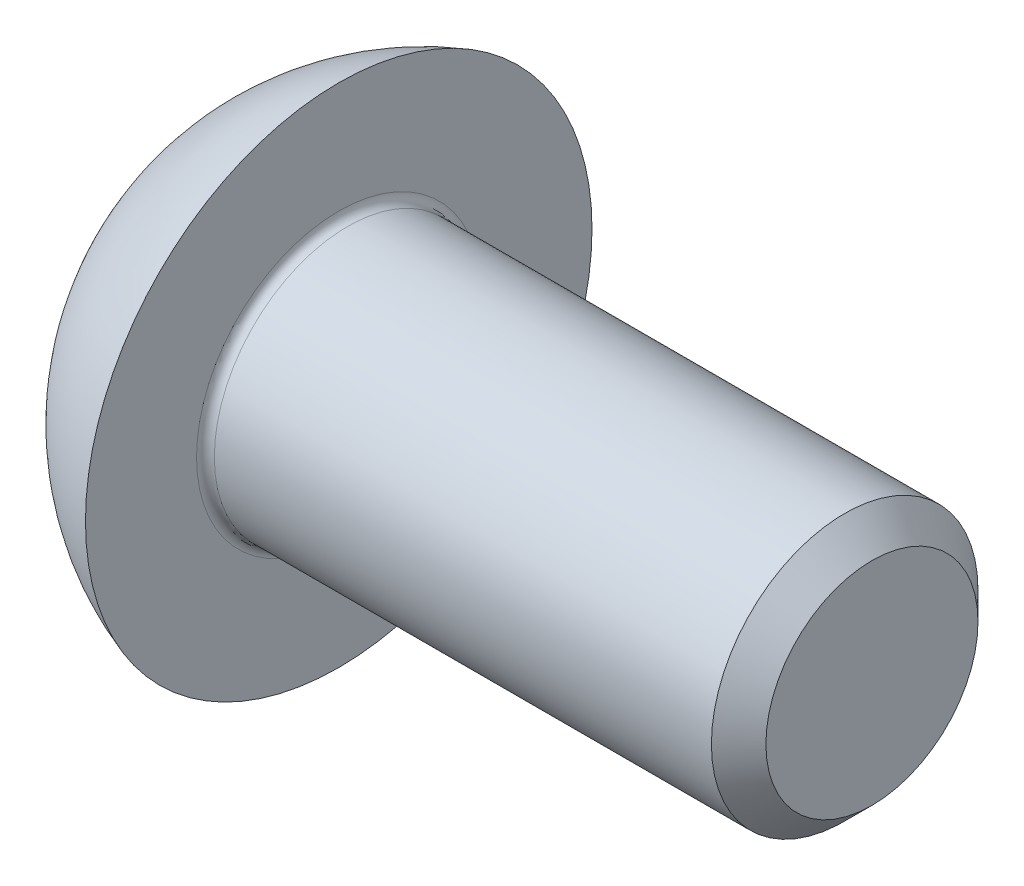
ISO-10303-21;
HEADER;
FILE_DESCRIPTION(('STEP AP214'),'2;1');
FILE_NAME('part.step','',(''),(''),'','','');
FILE_SCHEMA(('AUTOMOTIVE_DESIGN { 1 0 10303 214 1 1 1 1 }'));
ENDSEC;
DATA;
#1=APPLICATION_CONTEXT('core data for automotive mechanical design processes');
#2=APPLICATION_PROTOCOL_DEFINITION('international standard','automotive_design',2000,#1);
#3=PRODUCT_CONTEXT('',#1,'mechanical');
#4=PRODUCT('Part','Part','',(#3));
#5=PRODUCT_RELATED_PRODUCT_CATEGORY('part','',(#4));
#6=PRODUCT_DEFINITION_FORMATION('','',#4);
#7=PRODUCT_DEFINITION_CONTEXT('part definition',#1,'design');
#8=PRODUCT_DEFINITION('design','',#6,#7);
#9=PRODUCT_DEFINITION_SHAPE('','',#8);
#10=(LENGTH_UNIT() NAMED_UNIT(*) SI_UNIT(.MILLI.,.METRE.));
#11=(NAMED_UNIT(*) PLANE_ANGLE_UNIT() SI_UNIT($,.RADIAN.));
#12=(NAMED_UNIT(*) SI_UNIT($,.STERADIAN.) SOLID_ANGLE_UNIT());
#13=UNCERTAINTY_MEASURE_WITH_UNIT(LENGTH_MEASURE(1.E-05),#10,'distance_accuracy_value','');
#14=(GEOMETRIC_REPRESENTATION_CONTEXT(3) GLOBAL_UNCERTAINTY_ASSIGNED_CONTEXT((#13)) GLOBAL_UNIT_ASSIGNED_CONTEXT((#10,
#11,#12)) REPRESENTATION_CONTEXT('',''));
#15=CARTESIAN_POINT('',(0.,0.,0.));
#16=DIRECTION('',(0.,0.,1.));
#17=DIRECTION('',(1.,0.,0.));
#18=AXIS2_PLACEMENT_3D('',#15,#16,#17);
#19=CARTESIAN_POINT('',(6.,-1.1945,1.1945));
#20=DIRECTION('',(1.,0.,0.));
#21=DIRECTION('',(0.,0.,-1.));
#22=AXIS2_PLACEMENT_3D('',#19,#20,#21);
#23=PLANE('',#22);
#24=CARTESIAN_POINT('',(6.,0.,0.));
#25=DIRECTION('',(-1.,0.,0.));
#26=DIRECTION('',(0.,0.,1.));
#27=AXIS2_PLACEMENT_3D('',#24,#25,#26);
#28=CIRCLE('',#27,1.1935);
#29=CARTESIAN_POINT('',(6.,0.,1.1935));
#30=VERTEX_POINT('',#29);
#31=EDGE_CURVE('E22',#30,#30,#28,.T.);
#32=ORIENTED_EDGE('',*,*,#31,.F.);
#33=EDGE_LOOP('',(#32));
#34=FACE_BOUND('',#33,.T.);
#35=ADVANCED_FACE('F17',(#34),#23,.T.);
#36=CARTESIAN_POINT('',(5.6935,0.,0.));
#37=DIRECTION('',(-1.,0.,0.));
#38=DIRECTION('',(0.,0.,1.));
#39=AXIS2_PLACEMENT_3D('',#36,#37,#38);
#40=CONICAL_SURFACE('',#39,1.5,0.785398163397447);
#41=ORIENTED_EDGE('',*,*,#31,.T.);
#42=EDGE_LOOP('',(#41));
#43=FACE_BOUND('',#42,.T.);
#44=CARTESIAN_POINT('',(5.6935,0.,0.));
#45=DIRECTION('',(-1.,0.,0.));
#46=DIRECTION('',(0.,0.,1.));
#47=AXIS2_PLACEMENT_3D('',#44,#45,#46);
#48=CIRCLE('',#47,1.5);
#49=CARTESIAN_POINT('',(5.6935,0.,1.5));
#50=VERTEX_POINT('',#49);
#51=EDGE_CURVE('E151',#50,#50,#48,.T.);
#52=ORIENTED_EDGE('',*,*,#51,.F.);
#53=EDGE_LOOP('',(#52));
#54=FACE_BOUND('',#53,.T.);
#55=ADVANCED_FACE('F233',(#43,#54),#40,.T.);
#56=CARTESIAN_POINT('',(5.6935,0.,0.));
#57=DIRECTION('',(-1.,0.,0.));
#58=DIRECTION('',(0.,0.,1.));
#59=AXIS2_PLACEMENT_3D('',#56,#57,#58);
#60=CYLINDRICAL_SURFACE('',#59,1.5);
#61=CARTESIAN_POINT('',(0.0999999999999998,0.,0.));
#62=DIRECTION('',(-1.,0.,0.));
#63=DIRECTION('',(0.,0.,1.));
#64=AXIS2_PLACEMENT_3D('',#61,#62,#63);
#65=CIRCLE('',#64,1.5);
#66=CARTESIAN_POINT('',(0.0999999999999998,0.,1.5));
#67=VERTEX_POINT('',#66);
#68=EDGE_CURVE('E147',#67,#67,#65,.T.);
#69=ORIENTED_EDGE('',*,*,#68,.F.);
#70=EDGE_LOOP('',(#69));
#71=FACE_BOUND('',#70,.T.);
#72=ORIENTED_EDGE('',*,*,#51,.T.);
#73=EDGE_LOOP('',(#72));
#74=FACE_BOUND('',#73,.T.);
#75=ADVANCED_FACE('F227',(#71,#74),#60,.T.);
#76=CARTESIAN_POINT('',(0.0999999999999996,0.,0.));
#77=DIRECTION('',(1.,0.,0.));
#78=DIRECTION('',(0.,0.,-1.));
#79=AXIS2_PLACEMENT_3D('',#76,#77,#78);
#80=TOROIDAL_SURFACE('',#79,1.6,0.0999999999999997);
#81=CARTESIAN_POINT('',(0.,0.,0.));
#82=DIRECTION('',(1.,0.,0.));
#83=DIRECTION('',(0.,0.,-1.));
#84=AXIS2_PLACEMENT_3D('',#81,#82,#83);
#85=CIRCLE('',#84,1.6);
#86=CARTESIAN_POINT('',(0.,0.,-1.6));
#87=VERTEX_POINT('',#86);
#88=EDGE_CURVE('E150',#87,#87,#85,.F.);
#89=ORIENTED_EDGE('',*,*,#88,.F.);
#90=EDGE_LOOP('',(#89));
#91=FACE_BOUND('',#90,.T.);
#92=ORIENTED_EDGE('',*,*,#68,.T.);
#93=EDGE_LOOP('',(#92));
#94=FACE_BOUND('',#93,.T.);
#95=ADVANCED_FACE('F224',(#91,#94),#80,.F.);
#96=CARTESIAN_POINT('',(0.,-2.90802,2.851));
#97=DIRECTION('',(1.,0.,0.));
#98=DIRECTION('',(0.,0.,-1.));
#99=AXIS2_PLACEMENT_3D('',#96,#97,#98);
#100=PLANE('',#99);
#101=ORIENTED_EDGE('',*,*,#88,.T.);
#102=EDGE_LOOP('',(#101));
#103=FACE_BOUND('',#102,.T.);
#104=CARTESIAN_POINT('',(0.,0.,0.));
#105=DIRECTION('',(-1.,0.,0.));
#106=DIRECTION('',(0.,0.,1.));
#107=AXIS2_PLACEMENT_3D('',#104,#105,#106);
#108=CIRCLE('',#107,2.85);
#109=CARTESIAN_POINT('',(0.,2.84999999999999,0.));
#110=VERTEX_POINT('',#109);
#111=EDGE_CURVE('E212',#110,#110,#108,.T.);
#112=ORIENTED_EDGE('',*,*,#111,.F.);
#113=EDGE_LOOP('',(#112));
#114=FACE_BOUND('',#113,.T.);
#115=ADVANCED_FACE('F221',(#103,#114),#100,.T.);
#116=CARTESIAN_POINT('',(0.954545454545453,0.,0.));
#117=DIRECTION('',(-1.,0.,0.));
#118=DIRECTION('',(0.,1.,0.));
#119=AXIS2_PLACEMENT_3D('',#116,#117,#118);
#120=SPHERICAL_SURFACE('',#119,3.00560426949281);
#121=CARTESIAN_POINT('',(-1.65,0.,0.));
#122=DIRECTION('',(-1.,0.,0.));
#123=DIRECTION('',(0.,0.,1.));
#124=AXIS2_PLACEMENT_3D('',#121,#122,#123);
#125=CIRCLE('',#124,1.50000000000001);
#126=CARTESIAN_POINT('',(-1.65,1.5,0.));
#127=VERTEX_POINT('',#126);
#128=EDGE_CURVE('E409',#127,#127,#125,.T.);
#129=CARTESIAN_POINT('',(0.,2.84999999999999,0.));
#130=CARTESIAN_POINT('',(-0.0215260801317097,2.84279035808821,0.));
#131=CARTESIAN_POINT('',(-0.0429704467275896,2.83533674876494,0.));
#132=CARTESIAN_POINT('',(-0.0856848137203171,2.81994561798769,0.));
#133=CARTESIAN_POINT('',(-0.106954814117165,2.81200809653371,0.));
#134=CARTESIAN_POINT('',(-0.149309509584447,2.79565316418732,0.));
#135=CARTESIAN_POINT('',(-0.170394204654881,2.7872357532949,0.));
#136=CARTESIAN_POINT('',(-0.212367469466501,2.76992537771403,0.));
#137=CARTESIAN_POINT('',(-0.233256039207686,2.76103241302559,0.));
#138=CARTESIAN_POINT('',(-0.274826327623147,2.74277549181113,0.));
#139=CARTESIAN_POINT('',(-0.295508046297424,2.73341153528512,0.));
#140=CARTESIAN_POINT('',(-0.336654014762801,2.71421743894499,0.));
#141=CARTESIAN_POINT('',(-0.357118264553902,2.70438729913088,0.));
#142=CARTESIAN_POINT('',(-0.397818788625681,2.68426588282603,0.));
#143=CARTESIAN_POINT('',(-0.41805506290636,2.67397460633528,0.));
#144=CARTESIAN_POINT('',(-0.458289246498368,2.65293620038352,0.));
#145=CARTESIAN_POINT('',(-0.478287155809698,2.64218907092249,0.));
#146=CARTESIAN_POINT('',(-0.518034342349671,2.62024447668355,0.));
#147=CARTESIAN_POINT('',(-0.537783619578315,2.60904701190565,0.));
#148=CARTESIAN_POINT('',(-0.577023402498399,2.58620749591719,0.));
#149=CARTESIAN_POINT('',(-0.59651390818984,2.57456544470665,0.));
#150=CARTESIAN_POINT('',(-0.635226141434257,2.55084273298523,0.));
#151=CARTESIAN_POINT('',(-0.654447868987234,2.53876207247435,0.));
#152=CARTESIAN_POINT('',(-0.692612677347208,2.51416834447231,0.));
#153=CARTESIAN_POINT('',(-0.711555758154206,2.50165527698114,0.));
#154=CARTESIAN_POINT('',(-0.749153547474283,2.47620315933969,0.));
#155=CARTESIAN_POINT('',(-0.767808255987362,2.46326410918942,0.));
#156=CARTESIAN_POINT('',(-0.804819723224632,2.43696666925441,0.));
#157=CARTESIAN_POINT('',(-0.823176481948824,2.42360827946967,0.));
#158=CARTESIAN_POINT('',(-0.859582625083439,2.39647901858307,0.));
#159=CARTESIAN_POINT('',(-0.877632009493861,2.38270814748121,0.));
#160=CARTESIAN_POINT('',(-0.913414137284795,2.35476099404935,0.));
#161=CARTESIAN_POINT('',(-0.931146880665306,2.34058471171934,0.));
#162=CARTESIAN_POINT('',(-0.966286622246621,2.3118340140619,0.));
#163=CARTESIAN_POINT('',(-0.983693620447425,2.29725959873447,0.));
#164=CARTESIAN_POINT('',(-1.01817293476004,2.26772011771798,0.));
#165=CARTESIAN_POINT('',(-1.03524525087184,2.25275505202892,0.));
#166=CARTESIAN_POINT('',(-1.06904643592595,2.22244195348838,0.));
#167=CARTESIAN_POINT('',(-1.08577530486826,2.20709392063689,0.));
#168=CARTESIAN_POINT('',(-1.11888100683174,2.17602276758947,0.));
#169=CARTESIAN_POINT('',(-1.13525783985292,2.16029964739354,0.));
#170=CARTESIAN_POINT('',(-1.16765106196088,2.1284863920484,0.));
#171=CARTESIAN_POINT('',(-1.18366745104767,2.1123962568992,0.));
#172=CARTESIAN_POINT('',(-1.21533156232888,2.07985723246755,0.));
#173=CARTESIAN_POINT('',(-1.2309792845233,2.06340834318511,0.));
#174=CARTESIAN_POINT('',(-1.26189802833824,2.03016025549432,0.));
#175=CARTESIAN_POINT('',(-1.27716904995876,2.01336105708599,0.));
#176=CARTESIAN_POINT('',(-1.30732655234746,1.97942097600362,0.));
#177=CARTESIAN_POINT('',(-1.32221303311563,1.96228009332959,0.));
#178=CARTESIAN_POINT('',(-1.35159381094191,1.92766544399613,0.));
#179=CARTESIAN_POINT('',(-1.36608810800001,1.91019167733672,0.));
#180=CARTESIAN_POINT('',(-1.39467707692145,1.87492023123203,0.));
#181=CARTESIAN_POINT('',(-1.40877174878479,1.85712255178676,0.));
#182=CARTESIAN_POINT('',(-1.4365542309196,1.82121241755895,0.));
#183=CARTESIAN_POINT('',(-1.45024204119108,1.8030999627764,0.));
#184=CARTESIAN_POINT('',(-1.47720377294336,1.76656957712027,0.));
#185=CARTESIAN_POINT('',(-1.49047769442415,1.74815164624667,0.));
#186=CARTESIAN_POINT('',(-1.51660483272654,1.7110197637829,0.));
#187=CARTESIAN_POINT('',(-1.52945804954812,1.69230581219271,0.));
#188=CARTESIAN_POINT('',(-1.55473718300097,1.65459149828447,0.));
#189=CARTESIAN_POINT('',(-1.56716309963224,1.6355911359664,0.));
#190=CARTESIAN_POINT('',(-1.59158124034154,1.59731374780469,0.));
#191=CARTESIAN_POINT('',(-1.60357346441956,1.57803672196104,0.));
#192=CARTESIAN_POINT('',(-1.62711811082354,1.53921593268643,0.));
#193=CARTESIAN_POINT('',(-1.6386705331495,1.51967216925548,0.));
#194=CARTESIAN_POINT('',(-1.65,1.5,0.));
#195=B_SPLINE_CURVE_WITH_KNOTS('',3,(#129,#130,#131,#132,#133,#134,#135,#136,#137,#138,#139,
#140,#141,#142,#143,#144,#145,#146,#147,#148,#149,#150,#151,#152,#153,#154,#155,#156,#157,#158,
#159,#160,#161,#162,#163,#164,#165,#166,#167,#168,#169,#170,#171,#172,#173,#174,#175,#176,#177,
#178,#179,#180,#181,#182,#183,#184,#185,#186,#187,#188,#189,#190,#191,#192,#193,#194),
.UNSPECIFIED.,.F.,.F.,(4,2,2,2,2,2,2,2,2,2,2,2,2,2,2,2,2,2,2,2,2,2,2,2,2,2,2,2,2,2,2,2,4),(0.,
0.0681025747754093,0.136205149550818,0.204307724326228,0.272410299101637,0.340512873877046,
0.408615448652455,0.476718023427865,0.544820598203273,0.612923172978682,0.681025747754092,
0.749128322529501,0.81723089730491,0.88533347208032,0.953436046855729,1.02153862163114,
1.08964119640655,1.15774377118196,1.22584634595737,1.29394892073277,1.36205149550818,
1.43015407028359,1.498256645059,1.56635921983441,1.63446179460982,1.70256436938523,
1.77066694416064,1.83876951893605,1.90687209371146,1.97497466848687,2.04307724326228,
2.11117981803769,2.17928239281309),.UNSPECIFIED.);
#196=EDGE_CURVE('BSEAM324',#110,#127,#195,.T.);
#197=ORIENTED_EDGE('',*,*,#111,.T.);
#198=ORIENTED_EDGE('',*,*,#128,.F.);
#199=ORIENTED_EDGE('',*,*,#196,.T.);
#200=ORIENTED_EDGE('',*,*,#196,.F.);
#201=EDGE_LOOP('',(#197,#199,#198,#200));
#202=FACE_BOUND('',#201,.T.);
#203=ADVANCED_FACE('F324',(#202),#120,.T.);
#204=CARTESIAN_POINT('',(-1.45222583840039,0.,0.));
#205=DIRECTION('',(-1.,0.,0.));
#206=DIRECTION('',(0.,0.,1.));
#207=AXIS2_PLACEMENT_3D('',#204,#205,#206);
#208=CONICAL_SURFACE('',#207,0.956926376779635,0.785398163397453);
#209=CARTESIAN_POINT('',(-1.65,0.,0.));
#210=DIRECTION('',(-1.,0.,0.));
#211=DIRECTION('',(0.,0.,1.));
#212=AXIS2_PLACEMENT_3D('',#209,#210,#211);
#213=CIRCLE('',#212,1.15470053837925);
#214=CARTESIAN_POINT('',(-1.65,-0.577350269189623,0.999999999999997));
#215=VERTEX_POINT('',#214);
#216=CARTESIAN_POINT('',(-1.65,-1.15470053837925,0.));
#217=VERTEX_POINT('',#216);
#218=EDGE_CURVE('E413',#215,#217,#213,.F.);
#219=ORIENTED_EDGE('',*,*,#218,.F.);
#220=CARTESIAN_POINT('',(-1.65,-1.15470053837925,0.));
#221=CARTESIAN_POINT('',(-1.63017529968507,-1.13485670042499,0.0343705355539455));
#222=CARTESIAN_POINT('',(-1.61151503362409,-1.1146811143648,0.0693156756826654));
#223=CARTESIAN_POINT('',(-1.57734887687568,-1.07354102363067,0.140572403062168));
#224=CARTESIAN_POINT('',(-1.56186198997523,-1.05257260866811,0.17689076313152));
#225=CARTESIAN_POINT('',(-1.53533304033552,-1.01029074587997,0.250125097719241));
#226=CARTESIAN_POINT('',(-1.52422431255119,-0.988988061455529,0.287022429479971));
#227=CARTESIAN_POINT('',(-1.50710848689101,-0.94591416852366,0.361628600517748));
#228=CARTESIAN_POINT('',(-1.50108861981993,-0.924144274109626,0.399335163718265));
#229=CARTESIAN_POINT('',(-1.49565888473662,-0.886620806520287,0.464327716059165));
#230=CARTESIAN_POINT('',(-1.4948565669101,-0.870915961923708,0.491529304825413));
#231=CARTESIAN_POINT('',(-1.49620877972921,-0.839536741600867,0.545879708726471));
#232=CARTESIAN_POINT('',(-1.49836396353432,-0.823862373370924,0.573028510877277));
#233=CARTESIAN_POINT('',(-1.50912331968096,-0.777063216742011,0.654087027909927));
#234=CARTESIAN_POINT('',(-1.52202250819224,-0.746171392310698,0.707593237363459));
#235=CARTESIAN_POINT('',(-1.55313768059666,-0.691975810062385,0.801462739363314));
#236=CARTESIAN_POINT('',(-1.56971698772518,-0.668416956286833,0.842267871070656));
#237=CARTESIAN_POINT('',(-1.60706128496697,-0.622221239987482,0.922281198793169));
#238=CARTESIAN_POINT('',(-1.62781264964343,-0.599581657292271,0.961494106283432));
#239=CARTESIAN_POINT('',(-1.65,-0.577350269189627,0.999999999999994));
#240=B_SPLINE_CURVE_WITH_KNOTS('',3,(#220,#221,#222,#223,#224,#225,#226,#227,#228,#229,#230,
#231,#232,#233,#234,#235,#236,#237,#238,#239),.UNSPECIFIED.,.F.,.F.,(4,2,2,2,2,2,2,2,2,4),(0.,
0.13318294658068,0.267141541466272,0.398973326814759,0.530473323702847,0.624596460448433,
0.718740387482865,0.907081600587491,1.05673041329893,1.2058982062352),.UNSPECIFIED.);
#241=EDGE_CURVE('E138',#217,#215,#240,.T.);
#242=ORIENTED_EDGE('',*,*,#241,.F.);
#243=EDGE_LOOP('',(#219,#242));
#244=FACE_BOUND('',#243,.T.);
#245=ADVANCED_FACE('F317',(#244),#208,.F.);
#246=CARTESIAN_POINT('',(-1.45222583840039,0.,0.));
#247=DIRECTION('',(-1.,0.,0.));
#248=DIRECTION('',(0.,0.,1.));
#249=AXIS2_PLACEMENT_3D('',#246,#247,#248);
#250=CONICAL_SURFACE('',#249,0.956926376779639,0.785398163397452);
#251=CARTESIAN_POINT('',(-1.65,0.,0.));
#252=DIRECTION('',(-1.,0.,0.));
#253=DIRECTION('',(0.,0.,1.));
#254=AXIS2_PLACEMENT_3D('',#251,#252,#253);
#255=CIRCLE('',#254,1.15470053837925);
#256=CARTESIAN_POINT('',(-1.65,-0.577350269189622,-0.999999999999997));
#257=VERTEX_POINT('',#256);
#258=EDGE_CURVE('E416',#217,#257,#255,.F.);
#259=ORIENTED_EDGE('',*,*,#258,.F.);
#260=CARTESIAN_POINT('',(-1.65,-0.577350269189626,-0.999999999999994));
#261=CARTESIAN_POINT('',(-1.63017529968507,-0.597194107143885,-0.965629464446054));
#262=CARTESIAN_POINT('',(-1.61151503362409,-0.617369693204071,-0.930684324317334));
#263=CARTESIAN_POINT('',(-1.57734887687568,-0.658509783938198,-0.859427596937831));
#264=CARTESIAN_POINT('',(-1.56186198997523,-0.679478198900765,-0.823109236868479));
#265=CARTESIAN_POINT('',(-1.53533304033552,-0.721760061688908,-0.749874902280759));
#266=CARTESIAN_POINT('',(-1.52422431255119,-0.743062746113344,-0.71297757052003));
#267=CARTESIAN_POINT('',(-1.50710848689101,-0.786136639045212,-0.638371399482253));
#268=CARTESIAN_POINT('',(-1.50108861981993,-0.807906533459246,-0.600664836281736));
#269=CARTESIAN_POINT('',(-1.49565888473662,-0.845430001048586,-0.535672283940837));
#270=CARTESIAN_POINT('',(-1.4948565669101,-0.861134845645165,-0.508470695174588));
#271=CARTESIAN_POINT('',(-1.49620877972921,-0.892514065968006,-0.45412029127353));
#272=CARTESIAN_POINT('',(-1.49836396353432,-0.908188434197949,-0.426971489122724));
#273=CARTESIAN_POINT('',(-1.50912331968096,-0.954987590826862,-0.345912972090074));
#274=CARTESIAN_POINT('',(-1.52202250819224,-0.985879415258175,-0.292406762636542));
#275=CARTESIAN_POINT('',(-1.55313768059666,-1.04007499750649,-0.198537260636686));
#276=CARTESIAN_POINT('',(-1.56971698772518,-1.06363385128204,-0.157732128929345));
#277=CARTESIAN_POINT('',(-1.60706128496697,-1.10982956758139,-0.0777188012068307));
#278=CARTESIAN_POINT('',(-1.62781264964343,-1.1324691502766,-0.038505893716567));
#279=CARTESIAN_POINT('',(-1.65,-1.15470053837925,0.));
#280=B_SPLINE_CURVE_WITH_KNOTS('',3,(#260,#261,#262,#263,#264,#265,#266,#267,#268,#269,#270,
#271,#272,#273,#274,#275,#276,#277,#278,#279),.UNSPECIFIED.,.F.,.F.,(4,2,2,2,2,2,2,2,2,4),(0.,
0.133182946580679,0.267141541466271,0.398973326814757,0.530473323702844,0.624596460448431,
0.718740387482863,0.907081600587489,1.05673041329893,1.2058982062352),.UNSPECIFIED.);
#281=EDGE_CURVE('E139',#257,#217,#280,.T.);
#282=ORIENTED_EDGE('',*,*,#281,.F.);
#283=EDGE_LOOP('',(#259,#282));
#284=FACE_BOUND('',#283,.T.);
#285=ADVANCED_FACE('F311',(#284),#250,.F.);
#286=CARTESIAN_POINT('',(-1.45222583840039,0.,0.));
#287=DIRECTION('',(-1.,0.,0.));
#288=DIRECTION('',(0.,0.,1.));
#289=AXIS2_PLACEMENT_3D('',#286,#287,#288);
#290=CONICAL_SURFACE('',#289,0.95692637677965,0.785398163397453);
#291=CARTESIAN_POINT('',(-1.65,0.,0.));
#292=DIRECTION('',(-1.,0.,0.));
#293=DIRECTION('',(0.,0.,1.));
#294=AXIS2_PLACEMENT_3D('',#291,#292,#293);
#295=CIRCLE('',#294,1.15470053837926);
#296=CARTESIAN_POINT('',(-1.65,0.577350269189623,-0.999999999999997));
#297=VERTEX_POINT('',#296);
#298=EDGE_CURVE('E100',#257,#297,#295,.F.);
#299=ORIENTED_EDGE('',*,*,#298,.F.);
#300=CARTESIAN_POINT('',(-1.65,0.577350269189619,-1.));
#301=CARTESIAN_POINT('',(-1.63017529968507,0.5376625932811,-1.));
#302=CARTESIAN_POINT('',(-1.6115150336241,0.497311421160729,-1.));
#303=CARTESIAN_POINT('',(-1.57734887687568,0.415031239692474,-1.));
#304=CARTESIAN_POINT('',(-1.56186198997523,0.373094409767341,-1.));
#305=CARTESIAN_POINT('',(-1.53533304033552,0.288530684191054,-1.));
#306=CARTESIAN_POINT('',(-1.5242243125512,0.245925315342182,-1.));
#307=CARTESIAN_POINT('',(-1.50710848689101,0.159777529478446,-1.));
#308=CARTESIAN_POINT('',(-1.50108861981993,0.116237740650378,-1.));
#309=CARTESIAN_POINT('',(-1.49565888473663,0.041190805471699,-1.));
#310=CARTESIAN_POINT('',(-1.4948565669101,0.00978111627854074,-1.));
#311=CARTESIAN_POINT('',(-1.49620877972922,-0.0529773243671424,-1.));
#312=CARTESIAN_POINT('',(-1.49836396353432,-0.0843260608270298,-1.));
#313=CARTESIAN_POINT('',(-1.50912331968097,-0.177924374084856,-1.));
#314=CARTESIAN_POINT('',(-1.52202250819224,-0.239708022947484,-1.));
#315=CARTESIAN_POINT('',(-1.55313768059666,-0.348099187444109,-1.));
#316=CARTESIAN_POINT('',(-1.56971698772519,-0.395216894995211,-1.));
#317=CARTESIAN_POINT('',(-1.60706128496698,-0.48760832759391,-1.));
#318=CARTESIAN_POINT('',(-1.62781264964343,-0.532887492984332,-1.));
#319=CARTESIAN_POINT('',(-1.65,-0.577350269189619,-1.));
#320=B_SPLINE_CURVE_WITH_KNOTS('',3,(#300,#301,#302,#303,#304,#305,#306,#307,#308,#309,#310,
#311,#312,#313,#314,#315,#316,#317,#318,#319),.UNSPECIFIED.,.F.,.F.,(4,2,2,2,2,2,2,2,2,4),(0.,
0.133182946580679,0.267141541466271,0.398973326814757,0.530473323702845,0.624596460448433,
0.718740387482867,0.907081600587496,1.05673041329893,1.2058982062352),.UNSPECIFIED.);
#321=EDGE_CURVE('E59',#297,#257,#320,.T.);
#322=ORIENTED_EDGE('',*,*,#321,.F.);
#323=EDGE_LOOP('',(#299,#322));
#324=FACE_BOUND('',#323,.T.);
#325=ADVANCED_FACE('F197',(#324),#290,.F.);
#326=CARTESIAN_POINT('',(-1.45222583840039,0.,0.));
#327=DIRECTION('',(-1.,0.,0.));
#328=DIRECTION('',(0.,0.,1.));
#329=AXIS2_PLACEMENT_3D('',#326,#327,#328);
#330=CONICAL_SURFACE('',#329,0.956926376779637,0.785398163397452);
#331=CARTESIAN_POINT('',(-1.65,0.,0.));
#332=DIRECTION('',(-1.,0.,0.));
#333=DIRECTION('',(0.,0.,1.));
#334=AXIS2_PLACEMENT_3D('',#331,#332,#333);
#335=CIRCLE('',#334,1.15470053837925);
#336=CARTESIAN_POINT('',(-1.65,1.15470053837925,0.));
#337=VERTEX_POINT('',#336);
#338=EDGE_CURVE('E88',#297,#337,#335,.F.);
#339=ORIENTED_EDGE('',*,*,#338,.F.);
#340=CARTESIAN_POINT('',(-1.65,1.15470053837925,0.));
#341=CARTESIAN_POINT('',(-1.63017529968507,1.13485670042499,-0.0343705355539456));
#342=CARTESIAN_POINT('',(-1.61151503362409,1.1146811143648,-0.0693156756826654));
#343=CARTESIAN_POINT('',(-1.57734887687568,1.07354102363067,-0.140572403062168));
#344=CARTESIAN_POINT('',(-1.56186198997523,1.05257260866811,-0.17689076313152));
#345=CARTESIAN_POINT('',(-1.53533304033552,1.01029074587997,-0.250125097719241));
#346=CARTESIAN_POINT('',(-1.52422431255119,0.988988061455529,-0.287022429479971));
#347=CARTESIAN_POINT('',(-1.50710848689101,0.94591416852366,-0.361628600517748));
#348=CARTESIAN_POINT('',(-1.50108861981993,0.924144274109626,-0.399335163718265));
#349=CARTESIAN_POINT('',(-1.49565888473662,0.886620806520287,-0.464327716059165));
#350=CARTESIAN_POINT('',(-1.4948565669101,0.870915961923708,-0.491529304825413));
#351=CARTESIAN_POINT('',(-1.49620877972921,0.839536741600867,-0.545879708726471));
#352=CARTESIAN_POINT('',(-1.49836396353432,0.823862373370924,-0.573028510877277));
#353=CARTESIAN_POINT('',(-1.50912331968096,0.777063216742011,-0.654087027909927));
#354=CARTESIAN_POINT('',(-1.52202250819224,0.746171392310698,-0.707593237363459));
#355=CARTESIAN_POINT('',(-1.55313768059666,0.691975810062385,-0.801462739363314));
#356=CARTESIAN_POINT('',(-1.56971698772518,0.668416956286833,-0.842267871070656));
#357=CARTESIAN_POINT('',(-1.60706128496697,0.622221239987482,-0.922281198793169));
#358=CARTESIAN_POINT('',(-1.62781264964343,0.599581657292271,-0.961494106283433));
#359=CARTESIAN_POINT('',(-1.65,0.577350269189627,-0.999999999999995));
#360=B_SPLINE_CURVE_WITH_KNOTS('',3,(#340,#341,#342,#343,#344,#345,#346,#347,#348,#349,#350,
#351,#352,#353,#354,#355,#356,#357,#358,#359),.UNSPECIFIED.,.F.,.F.,(4,2,2,2,2,2,2,2,2,4),(0.,
0.13318294658068,0.267141541466272,0.398973326814759,0.530473323702847,0.624596460448433,
0.718740387482865,0.907081600587491,1.05673041329893,1.2058982062352),.UNSPECIFIED.);
#361=EDGE_CURVE('E85',#337,#297,#360,.T.);
#362=ORIENTED_EDGE('',*,*,#361,.F.);
#363=EDGE_LOOP('',(#339,#362));
#364=FACE_BOUND('',#363,.T.);
#365=ADVANCED_FACE('F87',(#364),#330,.F.);
#366=CARTESIAN_POINT('',(-1.651,-0.578350269189626,-1.));
#367=DIRECTION('',(0.,0.,1.));
#368=DIRECTION('',(1.,0.,0.));
#369=AXIS2_PLACEMENT_3D('',#366,#367,#368);
#370=PLANE('',#369);
#371=DIRECTION('',(1.,0.,0.));
#372=VECTOR('',#371,1.);
#373=CARTESIAN_POINT('',(-1.13,0.577350269189624,-0.999999999999999));
#374=LINE('',#373,#372);
#375=CARTESIAN_POINT('',(-0.61,0.577350269189625,-1.));
#376=VERTEX_POINT('',#375);
#377=EDGE_CURVE('E67',#297,#376,#374,.T.);
#378=ORIENTED_EDGE('',*,*,#377,.F.);
#379=ORIENTED_EDGE('',*,*,#321,.T.);
#380=DIRECTION('',(-1.,0.,0.));
#381=VECTOR('',#380,1.);
#382=CARTESIAN_POINT('',(-1.13,-0.577350269189623,-0.999999999999999));
#383=LINE('',#382,#381);
#384=CARTESIAN_POINT('',(-0.61,-0.577350269189623,-1.));
#385=VERTEX_POINT('',#384);
#386=EDGE_CURVE('E140',#385,#257,#383,.T.);
#387=ORIENTED_EDGE('',*,*,#386,.F.);
#388=DIRECTION('',(0.,-1.,0.));
#389=VECTOR('',#388,1.);
#390=CARTESIAN_POINT('',(-0.61,0.,-1.));
#391=LINE('',#390,#389);
#392=EDGE_CURVE('E143',#376,#385,#391,.T.);
#393=ORIENTED_EDGE('',*,*,#392,.F.);
#394=EDGE_LOOP('',(#378,#379,#387,#393));
#395=FACE_BOUND('',#394,.T.);
#396=ADVANCED_FACE('F196',(#395),#370,.T.);
#397=CARTESIAN_POINT('',(-1.651,-0.576850269189625,-1.00086602540378));
#398=DIRECTION('',(0.,0.866025403784438,0.500000000000001));
#399=DIRECTION('',(0.,-0.500000000000001,0.866025403784438));
#400=AXIS2_PLACEMENT_3D('',#397,#398,#399);
#401=PLANE('',#400);
#402=ORIENTED_EDGE('',*,*,#386,.T.);
#403=ORIENTED_EDGE('',*,*,#281,.T.);
#404=DIRECTION('',(-1.,0.,0.));
#405=VECTOR('',#404,1.);
#406=CARTESIAN_POINT('',(-1.13,-1.15470053837925,0.));
#407=LINE('',#406,#405);
#408=CARTESIAN_POINT('',(-0.61,-1.15470053837925,0.));
#409=VERTEX_POINT('',#408);
#410=EDGE_CURVE('E135',#409,#217,#407,.T.);
#411=ORIENTED_EDGE('',*,*,#410,.F.);
#412=DIRECTION('',(0.,-0.500000000000001,0.866025403784438));
#413=VECTOR('',#412,1.);
#414=CARTESIAN_POINT('',(-0.61,-0.577350269189624,-0.999999999999999));
#415=LINE('',#414,#413);
#416=EDGE_CURVE('E146',#385,#409,#415,.T.);
#417=ORIENTED_EDGE('',*,*,#416,.F.);
#418=EDGE_LOOP('',(#402,#403,#411,#417));
#419=FACE_BOUND('',#418,.T.);
#420=ADVANCED_FACE('F203',(#419),#401,.T.);
#421=CARTESIAN_POINT('',(-0.0903847577314565,0.,0.));
#422=DIRECTION('',(-1.,0.,0.));
#423=DIRECTION('',(0.,0.,1.));
#424=AXIS2_PLACEMENT_3D('',#421,#422,#423);
#425=CONICAL_SURFACE('',#424,0.,1.0471975511966);
#426=CARTESIAN_POINT('',(-0.610000000001589,0.,0.));
#427=DIRECTION('',(-1.,0.,0.));
#428=DIRECTION('',(0.,0.,1.));
#429=AXIS2_PLACEMENT_3D('',#426,#427,#428);
#430=CIRCLE('',#429,0.899999999999084);
#431=CARTESIAN_POINT('',(-0.610000000001589,0.,0.899999999999084));
#432=VERTEX_POINT('',#431);
#433=EDGE_CURVE('E129',#432,#432,#430,.F.);
#434=ORIENTED_EDGE('',*,*,#433,.F.);
#435=EDGE_LOOP('',(#434));
#436=FACE_BOUND('',#435,.T.);
#437=CARTESIAN_POINT('',(-0.0903847577314565,0.,0.));
#438=VERTEX_POINT('',#437);
#439=VERTEX_LOOP('',#438);
#440=FACE_BOUND('',#439,.T.);
#441=ADVANCED_FACE('F284',(#436,#440),#425,.F.);
#442=CARTESIAN_POINT('',(-1.651,-1.15520053837925,-0.000866025403784138));
#443=DIRECTION('',(0.,0.866025403784438,-0.500000000000001));
#444=DIRECTION('',(0.,0.500000000000001,0.866025403784438));
#445=AXIS2_PLACEMENT_3D('',#442,#443,#444);
#446=PLANE('',#445);
#447=ORIENTED_EDGE('',*,*,#410,.T.);
#448=ORIENTED_EDGE('',*,*,#241,.T.);
#449=DIRECTION('',(-1.,0.,0.));
#450=VECTOR('',#449,1.);
#451=CARTESIAN_POINT('',(-1.13,-0.577350269189626,1.));
#452=LINE('',#451,#450);
#453=CARTESIAN_POINT('',(-0.61,-0.577350269189626,1.));
#454=VERTEX_POINT('',#453);
#455=EDGE_CURVE('E125',#454,#215,#452,.T.);
#456=ORIENTED_EDGE('',*,*,#455,.F.);
#457=DIRECTION('',(0.,0.499999999999999,0.866025403784439));
#458=VECTOR('',#457,1.);
#459=CARTESIAN_POINT('',(-0.61,-1.15470053837925,0.));
#460=LINE('',#459,#458);
#461=EDGE_CURVE('E81',#409,#454,#460,.T.);
#462=ORIENTED_EDGE('',*,*,#461,.F.);
#463=EDGE_LOOP('',(#447,#448,#456,#462));
#464=FACE_BOUND('',#463,.T.);
#465=ADVANCED_FACE('F179',(#464),#446,.T.);
#466=CARTESIAN_POINT('',(-1.45222583840039,0.,0.));
#467=DIRECTION('',(-1.,0.,0.));
#468=DIRECTION('',(0.,0.,1.));
#469=AXIS2_PLACEMENT_3D('',#466,#467,#468);
#470=CONICAL_SURFACE('',#469,0.956926376779644,0.785398163397456);
#471=CARTESIAN_POINT('',(-1.65,0.,0.));
#472=DIRECTION('',(-1.,0.,0.));
#473=DIRECTION('',(0.,0.,1.));
#474=AXIS2_PLACEMENT_3D('',#471,#472,#473);
#475=CIRCLE('',#474,1.15470053837926);
#476=CARTESIAN_POINT('',(-1.65,0.577350269189622,0.999999999999997));
#477=VERTEX_POINT('',#476);
#478=EDGE_CURVE('E36',#477,#215,#475,.F.);
#479=ORIENTED_EDGE('',*,*,#478,.F.);
#480=CARTESIAN_POINT('',(-1.65,-0.57735026918962,1.));
#481=CARTESIAN_POINT('',(-1.63017529968507,-0.537662593281101,1.));
#482=CARTESIAN_POINT('',(-1.6115150336241,-0.497311421160729,1.));
#483=CARTESIAN_POINT('',(-1.57734887687568,-0.415031239692473,1.));
#484=CARTESIAN_POINT('',(-1.56186198997523,-0.373094409767341,1.));
#485=CARTESIAN_POINT('',(-1.53533304033552,-0.288530684191053,1.));
#486=CARTESIAN_POINT('',(-1.5242243125512,-0.24592531534218,1.));
#487=CARTESIAN_POINT('',(-1.50710848689101,-0.159777529478444,1.));
#488=CARTESIAN_POINT('',(-1.50108861981993,-0.116237740650376,1.));
#489=CARTESIAN_POINT('',(-1.49565888473663,-0.0411908054716964,1.));
#490=CARTESIAN_POINT('',(-1.4948565669101,-0.00978111627853818,1.));
#491=CARTESIAN_POINT('',(-1.49620877972922,0.0529773243671452,1.));
#492=CARTESIAN_POINT('',(-1.49836396353433,0.0843260608270326,1.));
#493=CARTESIAN_POINT('',(-1.50912331968097,0.177924374084859,1.));
#494=CARTESIAN_POINT('',(-1.52202250819224,0.239708022947487,1.));
#495=CARTESIAN_POINT('',(-1.55313768059666,0.348099187444112,1.));
#496=CARTESIAN_POINT('',(-1.56971698772519,0.395216894995213,1.));
#497=CARTESIAN_POINT('',(-1.60706128496698,0.487608327593911,1.));
#498=CARTESIAN_POINT('',(-1.62781264964343,0.532887492984332,1.));
#499=CARTESIAN_POINT('',(-1.65,0.577350269189619,1.));
#500=B_SPLINE_CURVE_WITH_KNOTS('',3,(#480,#481,#482,#483,#484,#485,#486,#487,#488,#489,#490,
#491,#492,#493,#494,#495,#496,#497,#498,#499),.UNSPECIFIED.,.F.,.F.,(4,2,2,2,2,2,2,2,2,4),(0.,
0.13318294658068,0.267141541466272,0.398973326814759,0.530473323702848,0.624596460448436,
0.71874038748287,0.9070816005875,1.05673041329893,1.2058982062352),.UNSPECIFIED.);
#501=EDGE_CURVE('E115',#215,#477,#500,.T.);
#502=ORIENTED_EDGE('',*,*,#501,.F.);
#503=EDGE_LOOP('',(#479,#502));
#504=FACE_BOUND('',#503,.T.);
#505=ADVANCED_FACE('F174',(#504),#470,.F.);
#506=CARTESIAN_POINT('',(-1.65,-1.53102,-1.501));
#507=DIRECTION('',(-1.,0.,0.));
#508=DIRECTION('',(0.,0.,1.));
#509=AXIS2_PLACEMENT_3D('',#506,#507,#508);
#510=PLANE('',#509);
#511=ORIENTED_EDGE('',*,*,#338,.T.);
#512=CARTESIAN_POINT('',(-1.65,0.,0.));
#513=DIRECTION('',(-1.,0.,0.));
#514=DIRECTION('',(0.,0.,1.));
#515=AXIS2_PLACEMENT_3D('',#512,#513,#514);
#516=CIRCLE('',#515,1.15470053837925);
#517=EDGE_CURVE('E97',#477,#337,#516,.T.);
#518=ORIENTED_EDGE('',*,*,#517,.F.);
#519=ORIENTED_EDGE('',*,*,#478,.T.);
#520=ORIENTED_EDGE('',*,*,#218,.T.);
#521=ORIENTED_EDGE('',*,*,#258,.T.);
#522=ORIENTED_EDGE('',*,*,#298,.T.);
#523=EDGE_LOOP('',(#511,#518,#519,#520,#521,#522));
#524=FACE_BOUND('',#523,.T.);
#525=ORIENTED_EDGE('',*,*,#128,.T.);
#526=EDGE_LOOP('',(#525));
#527=FACE_BOUND('',#526,.T.);
#528=ADVANCED_FACE('F94',(#524,#527),#510,.T.);
#529=CARTESIAN_POINT('',(-1.651,1.15520053837925,0.000866025403784138));
#530=DIRECTION('',(0.,-0.866025403784438,0.500000000000001));
#531=DIRECTION('',(0.,-0.500000000000001,-0.866025403784438));
#532=AXIS2_PLACEMENT_3D('',#529,#530,#531);
#533=PLANE('',#532);
#534=DIRECTION('',(1.,0.,0.));
#535=VECTOR('',#534,1.);
#536=CARTESIAN_POINT('',(-1.13,1.15470053837925,0.));
#537=LINE('',#536,#535);
#538=CARTESIAN_POINT('',(-0.61,1.15470053837925,0.));
#539=VERTEX_POINT('',#538);
#540=EDGE_CURVE('E103',#337,#539,#537,.T.);
#541=ORIENTED_EDGE('',*,*,#540,.F.);
#542=ORIENTED_EDGE('',*,*,#361,.T.);
#543=ORIENTED_EDGE('',*,*,#377,.T.);
#544=DIRECTION('',(0.,-0.499999999999999,-0.866025403784439));
#545=VECTOR('',#544,1.);
#546=CARTESIAN_POINT('',(-0.61,1.15470053837925,0.));
#547=LINE('',#546,#545);
#548=EDGE_CURVE('E90',#539,#376,#547,.T.);
#549=ORIENTED_EDGE('',*,*,#548,.F.);
#550=EDGE_LOOP('',(#541,#542,#543,#549));
#551=FACE_BOUND('',#550,.T.);
#552=ADVANCED_FACE('F104',(#551),#533,.T.);
#553=CARTESIAN_POINT('',(-0.61,-1.15570053837925,-1.001));
#554=DIRECTION('',(-1.,0.,0.));
#555=DIRECTION('',(0.,0.,1.));
#556=AXIS2_PLACEMENT_3D('',#553,#554,#555);
#557=PLANE('',#556);
#558=ORIENTED_EDGE('',*,*,#433,.T.);
#559=EDGE_LOOP('',(#558));
#560=FACE_BOUND('',#559,.T.);
#561=ORIENTED_EDGE('',*,*,#416,.T.);
#562=ORIENTED_EDGE('',*,*,#461,.T.);
#563=DIRECTION('',(0.,-1.,0.));
#564=VECTOR('',#563,1.);
#565=CARTESIAN_POINT('',(-0.61,0.,1.));
#566=LINE('',#565,#564);
#567=CARTESIAN_POINT('',(-0.61,0.577350269189623,0.999999999999999));
#568=VERTEX_POINT('',#567);
#569=EDGE_CURVE('E127',#568,#454,#566,.T.);
#570=ORIENTED_EDGE('',*,*,#569,.F.);
#571=DIRECTION('',(0.,-0.500000000000001,0.866025403784438));
#572=VECTOR('',#571,1.);
#573=CARTESIAN_POINT('',(-0.61,0.866025403784438,0.499999999999998));
#574=LINE('',#573,#572);
#575=EDGE_CURVE('E109',#539,#568,#574,.T.);
#576=ORIENTED_EDGE('',*,*,#575,.F.);
#577=ORIENTED_EDGE('',*,*,#548,.T.);
#578=ORIENTED_EDGE('',*,*,#392,.T.);
#579=EDGE_LOOP('',(#561,#562,#570,#576,#577,#578));
#580=FACE_BOUND('',#579,.T.);
#581=ADVANCED_FACE('F166',(#560,#580),#557,.T.);
#582=CARTESIAN_POINT('',(-0.609,-0.578350269189626,1.));
#583=DIRECTION('',(0.,0.,-1.));
#584=DIRECTION('',(-1.,0.,0.));
#585=AXIS2_PLACEMENT_3D('',#582,#583,#584);
#586=PLANE('',#585);
#587=ORIENTED_EDGE('',*,*,#455,.T.);
#588=ORIENTED_EDGE('',*,*,#501,.T.);
#589=DIRECTION('',(-1.,0.,0.));
#590=VECTOR('',#589,1.);
#591=CARTESIAN_POINT('',(-1.13,0.577350269189623,0.999999999999999));
#592=LINE('',#591,#590);
#593=EDGE_CURVE('E28',#568,#477,#592,.T.);
#594=ORIENTED_EDGE('',*,*,#593,.F.);
#595=ORIENTED_EDGE('',*,*,#569,.T.);
#596=EDGE_LOOP('',(#587,#588,#594,#595));
#597=FACE_BOUND('',#596,.T.);
#598=ADVANCED_FACE('F162',(#597),#586,.T.);
#599=CARTESIAN_POINT('',(-1.45222583840039,0.,0.));
#600=DIRECTION('',(-1.,0.,0.));
#601=DIRECTION('',(0.,0.,1.));
#602=AXIS2_PLACEMENT_3D('',#599,#600,#601);
#603=CONICAL_SURFACE('',#602,0.956926376779639,0.785398163397452);
#604=ORIENTED_EDGE('',*,*,#517,.T.);
#605=CARTESIAN_POINT('',(-1.65,0.577350269189626,0.999999999999994));
#606=CARTESIAN_POINT('',(-1.63017529968507,0.597194107143885,0.965629464446053));
#607=CARTESIAN_POINT('',(-1.61151503362409,0.617369693204071,0.930684324317334));
#608=CARTESIAN_POINT('',(-1.57734887687568,0.658509783938199,0.859427596937831));
#609=CARTESIAN_POINT('',(-1.56186198997523,0.679478198900765,0.823109236868479));
#610=CARTESIAN_POINT('',(-1.53533304033552,0.721760061688908,0.749874902280759));
#611=CARTESIAN_POINT('',(-1.52422431255119,0.743062746113345,0.712977570520029));
#612=CARTESIAN_POINT('',(-1.50710848689101,0.786136639045213,0.638371399482252));
#613=CARTESIAN_POINT('',(-1.50108861981993,0.807906533459247,0.600664836281735));
#614=CARTESIAN_POINT('',(-1.49565888473662,0.845430001048586,0.535672283940836));
#615=CARTESIAN_POINT('',(-1.4948565669101,0.861134845645165,0.508470695174588));
#616=CARTESIAN_POINT('',(-1.49620877972921,0.892514065968006,0.454120291273529));
#617=CARTESIAN_POINT('',(-1.49836396353432,0.90818843419795,0.426971489122724));
#618=CARTESIAN_POINT('',(-1.50912331968096,0.954987590826862,0.345912972090073));
#619=CARTESIAN_POINT('',(-1.52202250819224,0.985879415258176,0.292406762636541));
#620=CARTESIAN_POINT('',(-1.55313768059666,1.04007499750649,0.198537260636685));
#621=CARTESIAN_POINT('',(-1.56971698772518,1.06363385128204,0.157732128929344));
#622=CARTESIAN_POINT('',(-1.60706128496697,1.10982956758139,0.0777188012068305));
#623=CARTESIAN_POINT('',(-1.62781264964343,1.1324691502766,0.0385058937165671));
#624=CARTESIAN_POINT('',(-1.65,1.15470053837925,0.));
#625=B_SPLINE_CURVE_WITH_KNOTS('',3,(#605,#606,#607,#608,#609,#610,#611,#612,#613,#614,#615,
#616,#617,#618,#619,#620,#621,#622,#623,#624),.UNSPECIFIED.,.F.,.F.,(4,2,2,2,2,2,2,2,2,4),(0.,
0.13318294658068,0.267141541466271,0.398973326814757,0.530473323702845,0.624596460448431,
0.718740387482864,0.90708160058749,1.05673041329893,1.2058982062352),.UNSPECIFIED.);
#626=EDGE_CURVE('E11',#477,#337,#625,.T.);
#627=ORIENTED_EDGE('',*,*,#626,.F.);
#628=EDGE_LOOP('',(#604,#627));
#629=FACE_BOUND('',#628,.T.);
#630=ADVANCED_FACE('F113',(#629),#603,.F.);
#631=CARTESIAN_POINT('',(-1.651,0.576850269189625,1.00086602540378));
#632=DIRECTION('',(0.,-0.866025403784438,-0.500000000000001));
#633=DIRECTION('',(0.,0.500000000000001,-0.866025403784438));
#634=AXIS2_PLACEMENT_3D('',#631,#632,#633);
#635=PLANE('',#634);
#636=ORIENTED_EDGE('',*,*,#593,.T.);
#637=ORIENTED_EDGE('',*,*,#626,.T.);
#638=ORIENTED_EDGE('',*,*,#540,.T.);
#639=ORIENTED_EDGE('',*,*,#575,.T.);
#640=EDGE_LOOP('',(#636,#637,#638,#639));
#641=FACE_BOUND('',#640,.T.);
#642=ADVANCED_FACE('F19',(#641),#635,.T.);
#643=CLOSED_SHELL('',(#35,#55,#75,#95,#115,#203,#245,#285,#325,#365,#396,#420,#441,#465,#505,
#528,#552,#581,#598,#630,#642));
#644=MANIFOLD_SOLID_BREP('B1',#643);
#645=ADVANCED_BREP_SHAPE_REPRESENTATION('',(#18,#644),#14);
#646=SHAPE_DEFINITION_REPRESENTATION(#9,#645);
ENDSEC;
END-ISO-10303-21;
